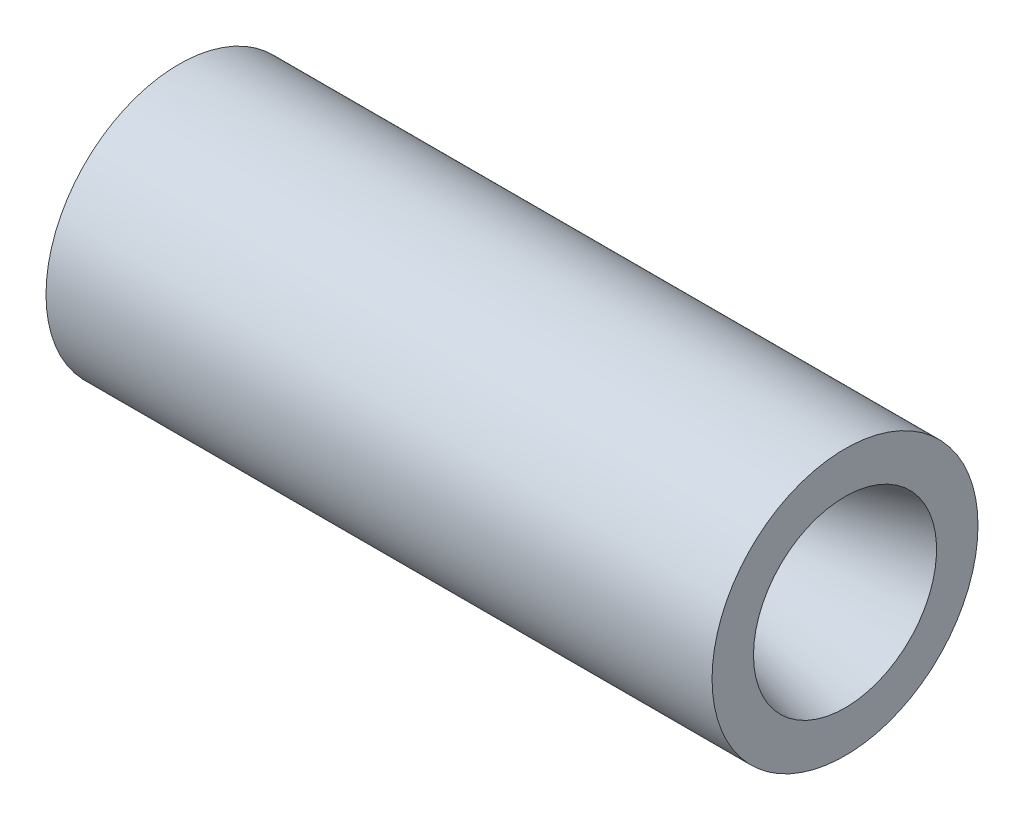
ISO-10303-21;
HEADER;
FILE_DESCRIPTION(('STEP AP214'),'2;1');
FILE_NAME('part.step','',(''),(''),'','','');
FILE_SCHEMA(('AUTOMOTIVE_DESIGN { 1 0 10303 214 1 1 1 1 }'));
ENDSEC;
DATA;
#1=APPLICATION_CONTEXT('core data for automotive mechanical design processes');
#2=APPLICATION_PROTOCOL_DEFINITION('international standard','automotive_design',2000,#1);
#3=PRODUCT_CONTEXT('',#1,'mechanical');
#4=PRODUCT('Part','Part','',(#3));
#5=PRODUCT_RELATED_PRODUCT_CATEGORY('part','',(#4));
#6=PRODUCT_DEFINITION_FORMATION('','',#4);
#7=PRODUCT_DEFINITION_CONTEXT('part definition',#1,'design');
#8=PRODUCT_DEFINITION('design','',#6,#7);
#9=PRODUCT_DEFINITION_SHAPE('','',#8);
#10=(LENGTH_UNIT() NAMED_UNIT(*) SI_UNIT(.MILLI.,.METRE.));
#11=(NAMED_UNIT(*) PLANE_ANGLE_UNIT() SI_UNIT($,.RADIAN.));
#12=(NAMED_UNIT(*) SI_UNIT($,.STERADIAN.) SOLID_ANGLE_UNIT());
#13=UNCERTAINTY_MEASURE_WITH_UNIT(LENGTH_MEASURE(1.E-05),#10,'distance_accuracy_value','');
#14=(GEOMETRIC_REPRESENTATION_CONTEXT(3) GLOBAL_UNCERTAINTY_ASSIGNED_CONTEXT((#13)) GLOBAL_UNIT_ASSIGNED_CONTEXT((#10,
#11,#12)) REPRESENTATION_CONTEXT('',''));
#15=CARTESIAN_POINT('',(0.,0.,0.));
#16=DIRECTION('',(0.,0.,1.));
#17=DIRECTION('',(1.,0.,0.));
#18=AXIS2_PLACEMENT_3D('',#15,#16,#17);
#19=CARTESIAN_POINT('',(0.,53.34,0.));
#20=DIRECTION('',(1.,0.,0.));
#21=DIRECTION('',(0.,0.,-1.));
#22=AXIS2_PLACEMENT_3D('',#19,#20,#21);
#23=PLANE('',#22);
#24=CARTESIAN_POINT('',(0.,0.,0.));
#25=DIRECTION('',(-1.,0.,0.));
#26=DIRECTION('',(0.,0.,1.));
#27=AXIS2_PLACEMENT_3D('',#24,#25,#26);
#28=CIRCLE('',#27,43.2765708);
#29=CARTESIAN_POINT('',(0.,0.,43.2765708));
#30=VERTEX_POINT('',#29);
#31=EDGE_CURVE('E62',#30,#30,#28,.T.);
#32=ORIENTED_EDGE('',*,*,#31,.F.);
#33=EDGE_LOOP('',(#32));
#34=FACE_BOUND('',#33,.T.);
#35=CARTESIAN_POINT('',(0.,0.,0.));
#36=DIRECTION('',(-1.,0.,0.));
#37=DIRECTION('',(0.,0.,1.));
#38=AXIS2_PLACEMENT_3D('',#35,#36,#37);
#39=CIRCLE('',#38,53.34);
#40=CARTESIAN_POINT('',(0.,0.,53.34));
#41=VERTEX_POINT('',#40);
#42=EDGE_CURVE('E10',#41,#41,#39,.T.);
#43=ORIENTED_EDGE('',*,*,#42,.T.);
#44=EDGE_LOOP('',(#43));
#45=FACE_BOUND('',#44,.T.);
#46=ADVANCED_FACE('F34',(#34,#45),#23,.F.);
#47=CARTESIAN_POINT('',(0.,0.,0.));
#48=DIRECTION('',(-1.,0.,0.));
#49=DIRECTION('',(0.,0.,1.));
#50=AXIS2_PLACEMENT_3D('',#47,#48,#49);
#51=CYLINDRICAL_SURFACE('',#50,53.34);
#52=ORIENTED_EDGE('',*,*,#42,.F.);
#53=EDGE_LOOP('',(#52));
#54=FACE_BOUND('',#53,.T.);
#55=CARTESIAN_POINT('',(267.174286043483,0.,0.));
#56=DIRECTION('',(-1.,0.,0.));
#57=DIRECTION('',(0.,0.,1.));
#58=AXIS2_PLACEMENT_3D('',#55,#56,#57);
#59=CIRCLE('',#58,53.34);
#60=CARTESIAN_POINT('',(267.174286043483,0.,53.34));
#61=VERTEX_POINT('',#60);
#62=EDGE_CURVE('E40',#61,#61,#59,.T.);
#63=ORIENTED_EDGE('',*,*,#62,.T.);
#64=EDGE_LOOP('',(#63));
#65=FACE_BOUND('',#64,.T.);
#66=ADVANCED_FACE('F69',(#54,#65),#51,.T.);
#67=CARTESIAN_POINT('',(267.174286043483,36.7237391,0.));
#68=DIRECTION('',(-1.,0.,0.));
#69=DIRECTION('',(0.,0.,1.));
#70=AXIS2_PLACEMENT_3D('',#67,#68,#69);
#71=PLANE('',#70);
#72=ORIENTED_EDGE('',*,*,#62,.F.);
#73=EDGE_LOOP('',(#72));
#74=FACE_BOUND('',#73,.T.);
#75=CARTESIAN_POINT('',(267.174286043483,0.,0.));
#76=DIRECTION('',(-1.,0.,0.));
#77=DIRECTION('',(0.,0.,1.));
#78=AXIS2_PLACEMENT_3D('',#75,#76,#77);
#79=CIRCLE('',#78,36.7237391);
#80=CARTESIAN_POINT('',(267.174286043483,0.,36.7237391));
#81=VERTEX_POINT('',#80);
#82=EDGE_CURVE('E44',#81,#81,#79,.T.);
#83=ORIENTED_EDGE('',*,*,#82,.T.);
#84=EDGE_LOOP('',(#83));
#85=FACE_BOUND('',#84,.T.);
#86=ADVANCED_FACE('F73',(#74,#85),#71,.F.);
#87=CARTESIAN_POINT('',(195.627585001949,0.,0.));
#88=DIRECTION('',(1.,0.,0.));
#89=DIRECTION('',(0.,0.,-1.));
#90=AXIS2_PLACEMENT_3D('',#87,#88,#89);
#91=CONICAL_SURFACE('',#90,17.55285833481,0.26179938779915);
#92=ORIENTED_EDGE('',*,*,#82,.F.);
#93=EDGE_LOOP('',(#92));
#94=FACE_BOUND('',#93,.T.);
#95=CARTESIAN_POINT('',(195.627585001949,0.,0.));
#96=DIRECTION('',(-1.,0.,0.));
#97=DIRECTION('',(0.,0.,1.));
#98=AXIS2_PLACEMENT_3D('',#95,#96,#97);
#99=CIRCLE('',#98,17.55285833481);
#100=CARTESIAN_POINT('',(195.627585001949,0.,17.55285833481));
#101=VERTEX_POINT('',#100);
#102=EDGE_CURVE('E48',#101,#101,#99,.T.);
#103=ORIENTED_EDGE('',*,*,#102,.T.);
#104=EDGE_LOOP('',(#103));
#105=FACE_BOUND('',#104,.T.);
#106=ADVANCED_FACE('F78',(#94,#105),#91,.F.);
#107=CARTESIAN_POINT('',(191.234269562369,0.,0.));
#108=DIRECTION('',(-1.,0.,0.));
#109=DIRECTION('',(0.,0.,1.));
#110=AXIS2_PLACEMENT_3D('',#107,#108,#109);
#111=TOROIDAL_SURFACE('',#110,33.948934769,16.9744673845);
#112=ORIENTED_EDGE('',*,*,#102,.F.);
#113=EDGE_LOOP('',(#112));
#114=FACE_BOUND('',#113,.T.);
#115=CARTESIAN_POINT('',(181.49811505101,0.,0.));
#116=DIRECTION('',(-1.,0.,0.));
#117=DIRECTION('',(0.,0.,1.));
#118=AXIS2_PLACEMENT_3D('',#115,#116,#117);
#119=CIRCLE('',#118,20.04426511027);
#120=CARTESIAN_POINT('',(181.49811505101,0.,20.04426511027));
#121=VERTEX_POINT('',#120);
#122=EDGE_CURVE('E53',#121,#121,#119,.T.);
#123=ORIENTED_EDGE('',*,*,#122,.T.);
#124=EDGE_LOOP('',(#123));
#125=FACE_BOUND('',#124,.T.);
#126=ADVANCED_FACE('F84',(#114,#125),#111,.T.);
#127=CARTESIAN_POINT('',(152.703069491359,0.,0.));
#128=DIRECTION('',(-1.,0.,0.));
#129=DIRECTION('',(0.,0.,1.));
#130=AXIS2_PLACEMENT_3D('',#127,#128,#129);
#131=CONICAL_SURFACE('',#130,40.20677307423,0.610865238198016);
#132=ORIENTED_EDGE('',*,*,#122,.F.);
#133=EDGE_LOOP('',(#132));
#134=FACE_BOUND('',#133,.T.);
#135=CARTESIAN_POINT('',(152.703069491359,0.,0.));
#136=DIRECTION('',(-1.,0.,0.));
#137=DIRECTION('',(0.,0.,1.));
#138=AXIS2_PLACEMENT_3D('',#135,#136,#137);
#139=CIRCLE('',#138,40.20677307423);
#140=CARTESIAN_POINT('',(152.703069491359,0.,40.20677307423));
#141=VERTEX_POINT('',#140);
#142=EDGE_CURVE('E56',#141,#141,#139,.T.);
#143=ORIENTED_EDGE('',*,*,#142,.T.);
#144=EDGE_LOOP('',(#143));
#145=FACE_BOUND('',#144,.T.);
#146=ADVANCED_FACE('F88',(#134,#145),#131,.F.);
#147=CARTESIAN_POINT('',(142.96691498,0.,0.));
#148=DIRECTION('',(-1.,0.,0.));
#149=DIRECTION('',(0.,0.,1.));
#150=AXIS2_PLACEMENT_3D('',#147,#148,#149);
#151=TOROIDAL_SURFACE('',#150,26.3021034155,16.9744673845);
#152=ORIENTED_EDGE('',*,*,#142,.F.);
#153=EDGE_LOOP('',(#152));
#154=FACE_BOUND('',#153,.T.);
#155=CARTESIAN_POINT('',(142.96691498,0.,0.));
#156=DIRECTION('',(-1.,0.,0.));
#157=DIRECTION('',(0.,0.,1.));
#158=AXIS2_PLACEMENT_3D('',#155,#156,#157);
#159=CIRCLE('',#158,43.2765708);
#160=CARTESIAN_POINT('',(142.96691498,0.,43.2765708));
#161=VERTEX_POINT('',#160);
#162=EDGE_CURVE('E59',#161,#161,#159,.T.);
#163=ORIENTED_EDGE('',*,*,#162,.T.);
#164=EDGE_LOOP('',(#163));
#165=FACE_BOUND('',#164,.T.);
#166=ADVANCED_FACE('F92',(#154,#165),#151,.F.);
#167=CARTESIAN_POINT('',(0.,0.,0.));
#168=DIRECTION('',(-1.,0.,0.));
#169=DIRECTION('',(0.,0.,1.));
#170=AXIS2_PLACEMENT_3D('',#167,#168,#169);
#171=CYLINDRICAL_SURFACE('',#170,43.2765708);
#172=ORIENTED_EDGE('',*,*,#162,.F.);
#173=EDGE_LOOP('',(#172));
#174=FACE_BOUND('',#173,.T.);
#175=ORIENTED_EDGE('',*,*,#31,.T.);
#176=EDGE_LOOP('',(#175));
#177=FACE_BOUND('',#176,.T.);
#178=ADVANCED_FACE('F66',(#174,#177),#171,.F.);
#179=CLOSED_SHELL('',(#46,#66,#86,#106,#126,#146,#166,#178));
#180=MANIFOLD_SOLID_BREP('B2',#179);
#181=ADVANCED_BREP_SHAPE_REPRESENTATION('',(#18,#180),#14);
#182=SHAPE_DEFINITION_REPRESENTATION(#9,#181);
ENDSEC;
END-ISO-10303-21;
